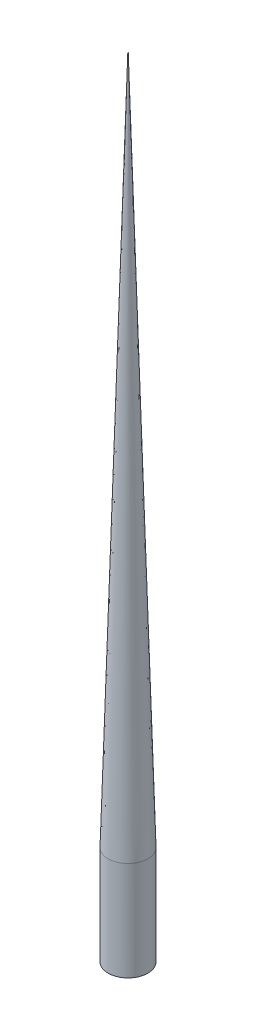
ISO-10303-21;
HEADER;
FILE_DESCRIPTION(('STEP AP214'),'2;1');
FILE_NAME('part.step','',(''),(''),'','','');
FILE_SCHEMA(('AUTOMOTIVE_DESIGN { 1 0 10303 214 1 1 1 1 }'));
ENDSEC;
DATA;
#1=APPLICATION_CONTEXT('core data for automotive mechanical design processes');
#2=APPLICATION_PROTOCOL_DEFINITION('international standard','automotive_design',2000,#1);
#3=PRODUCT_CONTEXT('',#1,'mechanical');
#4=PRODUCT('Part','Part','',(#3));
#5=PRODUCT_RELATED_PRODUCT_CATEGORY('part','',(#4));
#6=PRODUCT_DEFINITION_FORMATION('','',#4);
#7=PRODUCT_DEFINITION_CONTEXT('part definition',#1,'design');
#8=PRODUCT_DEFINITION('design','',#6,#7);
#9=PRODUCT_DEFINITION_SHAPE('','',#8);
#10=(LENGTH_UNIT() NAMED_UNIT(*) SI_UNIT(.MILLI.,.METRE.));
#11=(NAMED_UNIT(*) PLANE_ANGLE_UNIT() SI_UNIT($,.RADIAN.));
#12=(NAMED_UNIT(*) SI_UNIT($,.STERADIAN.) SOLID_ANGLE_UNIT());
#13=UNCERTAINTY_MEASURE_WITH_UNIT(LENGTH_MEASURE(1.E-05),#10,'distance_accuracy_value','');
#14=(GEOMETRIC_REPRESENTATION_CONTEXT(3) GLOBAL_UNCERTAINTY_ASSIGNED_CONTEXT((#13)) GLOBAL_UNIT_ASSIGNED_CONTEXT((#10,
#11,#12)) REPRESENTATION_CONTEXT('',''));
#15=CARTESIAN_POINT('',(0.,0.,0.));
#16=DIRECTION('',(0.,0.,1.));
#17=DIRECTION('',(1.,0.,0.));
#18=AXIS2_PLACEMENT_3D('',#15,#16,#17);
#19=CARTESIAN_POINT('',(0.5,0.,0.));
#20=DIRECTION('',(0.,-1.,0.));
#21=DIRECTION('',(0.,0.,-1.));
#22=AXIS2_PLACEMENT_3D('',#19,#20,#21);
#23=PLANE('',#22);
#24=CARTESIAN_POINT('',(0.,0.,0.));
#25=DIRECTION('',(0.,-1.,0.));
#26=DIRECTION('',(0.,0.,-1.));
#27=AXIS2_PLACEMENT_3D('',#24,#25,#26);
#28=CIRCLE('',#27,1.);
#29=CARTESIAN_POINT('',(0.,0.,-1.));
#30=VERTEX_POINT('',#29);
#31=EDGE_CURVE('E20',#30,#30,#28,.F.);
#32=ORIENTED_EDGE('',*,*,#31,.F.);
#33=EDGE_LOOP('',(#32));
#34=FACE_BOUND('',#33,.T.);
#35=ADVANCED_FACE('F17',(#34),#23,.T.);
#36=CARTESIAN_POINT('',(0.,2.5,0.));
#37=DIRECTION('',(0.,-1.,0.));
#38=DIRECTION('',(0.,0.,-1.));
#39=AXIS2_PLACEMENT_3D('',#36,#37,#38);
#40=CYLINDRICAL_SURFACE('',#39,1.);
#41=CARTESIAN_POINT('',(0.,4.99999999999545,0.));
#42=DIRECTION('',(0.,-1.,0.));
#43=DIRECTION('',(1.,0.,0.));
#44=AXIS2_PLACEMENT_3D('',#41,#42,#43);
#45=CIRCLE('',#44,0.999999999429235);
#46=CARTESIAN_POINT('',(0.999999999429235,4.99999999999545,0.));
#47=VERTEX_POINT('',#46);
#48=EDGE_CURVE('E11',#47,#47,#45,.F.);
#49=ORIENTED_EDGE('',*,*,#48,.F.);
#50=EDGE_LOOP('',(#49));
#51=FACE_BOUND('',#50,.T.);
#52=ORIENTED_EDGE('',*,*,#31,.T.);
#53=EDGE_LOOP('',(#52));
#54=FACE_BOUND('',#53,.T.);
#55=ADVANCED_FACE('F30',(#51,#54),#40,.T.);
#56=CARTESIAN_POINT('',(0.,5.0000000000523,0.));
#57=DIRECTION('',(0.,-1.,0.));
#58=DIRECTION('',(0.,0.,-1.));
#59=AXIS2_PLACEMENT_3D('',#56,#57,#58);
#60=CONICAL_SURFACE('',#59,0.999999999429235,0.0285636577493974);
#61=CARTESIAN_POINT('',(-9.9475983006414E-10,40.0000000548175,0.));
#62=VERTEX_POINT('',#61);
#63=VERTEX_LOOP('',#62);
#64=FACE_BOUND('',#63,.T.);
#65=ORIENTED_EDGE('',*,*,#48,.T.);
#66=EDGE_LOOP('',(#65));
#67=FACE_BOUND('',#66,.T.);
#68=ADVANCED_FACE('F27',(#64,#67),#60,.T.);
#69=CLOSED_SHELL('',(#35,#55,#68));
#70=MANIFOLD_SOLID_BREP('B1',#69);
#71=ADVANCED_BREP_SHAPE_REPRESENTATION('',(#18,#70),#14);
#72=SHAPE_DEFINITION_REPRESENTATION(#9,#71);
ENDSEC;
END-ISO-10303-21;
